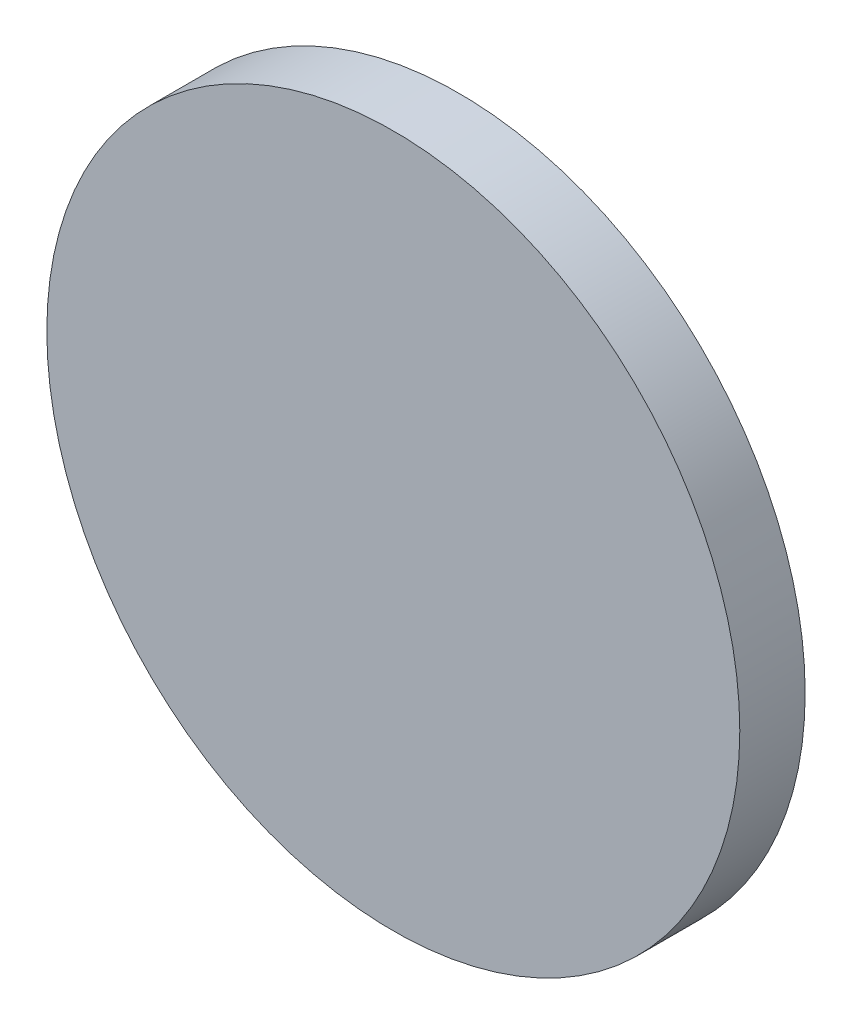
ISO-10303-21;
HEADER;
FILE_DESCRIPTION(('STEP AP214'),'2;1');
FILE_NAME('part.step','',(''),(''),'','','');
FILE_SCHEMA(('AUTOMOTIVE_DESIGN { 1 0 10303 214 1 1 1 1 }'));
ENDSEC;
DATA;
#1=APPLICATION_CONTEXT('core data for automotive mechanical design processes');
#2=APPLICATION_PROTOCOL_DEFINITION('international standard','automotive_design',2000,#1);
#3=PRODUCT_CONTEXT('',#1,'mechanical');
#4=PRODUCT('Part','Part','',(#3));
#5=PRODUCT_RELATED_PRODUCT_CATEGORY('part','',(#4));
#6=PRODUCT_DEFINITION_FORMATION('','',#4);
#7=PRODUCT_DEFINITION_CONTEXT('part definition',#1,'design');
#8=PRODUCT_DEFINITION('design','',#6,#7);
#9=PRODUCT_DEFINITION_SHAPE('','',#8);
#10=(LENGTH_UNIT() NAMED_UNIT(*) SI_UNIT(.MILLI.,.METRE.));
#11=(NAMED_UNIT(*) PLANE_ANGLE_UNIT() SI_UNIT($,.RADIAN.));
#12=(NAMED_UNIT(*) SI_UNIT($,.STERADIAN.) SOLID_ANGLE_UNIT());
#13=UNCERTAINTY_MEASURE_WITH_UNIT(LENGTH_MEASURE(1.E-05),#10,'distance_accuracy_value','');
#14=(GEOMETRIC_REPRESENTATION_CONTEXT(3) GLOBAL_UNCERTAINTY_ASSIGNED_CONTEXT((#13)) GLOBAL_UNIT_ASSIGNED_CONTEXT((#10,
#11,#12)) REPRESENTATION_CONTEXT('',''));
#15=CARTESIAN_POINT('',(0.,0.,0.));
#16=DIRECTION('',(0.,0.,1.));
#17=DIRECTION('',(1.,0.,0.));
#18=AXIS2_PLACEMENT_3D('',#15,#16,#17);
#19=CARTESIAN_POINT('',(0.,0.,254.));
#20=DIRECTION('',(0.,0.,-1.));
#21=DIRECTION('',(-1.,0.,0.));
#22=AXIS2_PLACEMENT_3D('',#19,#20,#21);
#23=CYLINDRICAL_SURFACE('',#22,1346.2);
#24=CARTESIAN_POINT('',(0.,0.,254.));
#25=DIRECTION('',(0.,0.,1.));
#26=DIRECTION('',(1.,0.,0.));
#27=AXIS2_PLACEMENT_3D('',#24,#25,#26);
#28=CIRCLE('',#27,1346.2);
#29=CARTESIAN_POINT('',(1346.2,0.,254.));
#30=VERTEX_POINT('',#29);
#31=EDGE_CURVE('E10',#30,#30,#28,.T.);
#32=ORIENTED_EDGE('',*,*,#31,.F.);
#33=EDGE_LOOP('',(#32));
#34=FACE_BOUND('',#33,.T.);
#35=CARTESIAN_POINT('',(0.,0.,0.));
#36=DIRECTION('',(0.,0.,1.));
#37=DIRECTION('',(1.,0.,0.));
#38=AXIS2_PLACEMENT_3D('',#35,#36,#37);
#39=CIRCLE('',#38,1346.2);
#40=CARTESIAN_POINT('',(1346.2,0.,0.));
#41=VERTEX_POINT('',#40);
#42=EDGE_CURVE('E34',#41,#41,#39,.T.);
#43=ORIENTED_EDGE('',*,*,#42,.T.);
#44=EDGE_LOOP('',(#43));
#45=FACE_BOUND('',#44,.T.);
#46=ADVANCED_FACE('F31',(#34,#45),#23,.T.);
#47=CARTESIAN_POINT('',(0.,0.,254.));
#48=DIRECTION('',(0.,0.,1.));
#49=DIRECTION('',(1.,0.,0.));
#50=AXIS2_PLACEMENT_3D('',#47,#48,#49);
#51=PLANE('',#50);
#52=ORIENTED_EDGE('',*,*,#31,.T.);
#53=EDGE_LOOP('',(#52));
#54=FACE_BOUND('',#53,.T.);
#55=ADVANCED_FACE('F46',(#54),#51,.T.);
#56=CARTESIAN_POINT('',(0.,0.,0.));
#57=DIRECTION('',(0.,0.,1.));
#58=DIRECTION('',(1.,0.,0.));
#59=AXIS2_PLACEMENT_3D('',#56,#57,#58);
#60=PLANE('',#59);
#61=ORIENTED_EDGE('',*,*,#42,.F.);
#62=EDGE_LOOP('',(#61));
#63=FACE_BOUND('',#62,.T.);
#64=ADVANCED_FACE('F44',(#63),#60,.F.);
#65=CLOSED_SHELL('',(#46,#55,#64));
#66=MANIFOLD_SOLID_BREP('B2',#65);
#67=ADVANCED_BREP_SHAPE_REPRESENTATION('',(#18,#66),#14);
#68=SHAPE_DEFINITION_REPRESENTATION(#9,#67);
ENDSEC;
END-ISO-10303-21;
